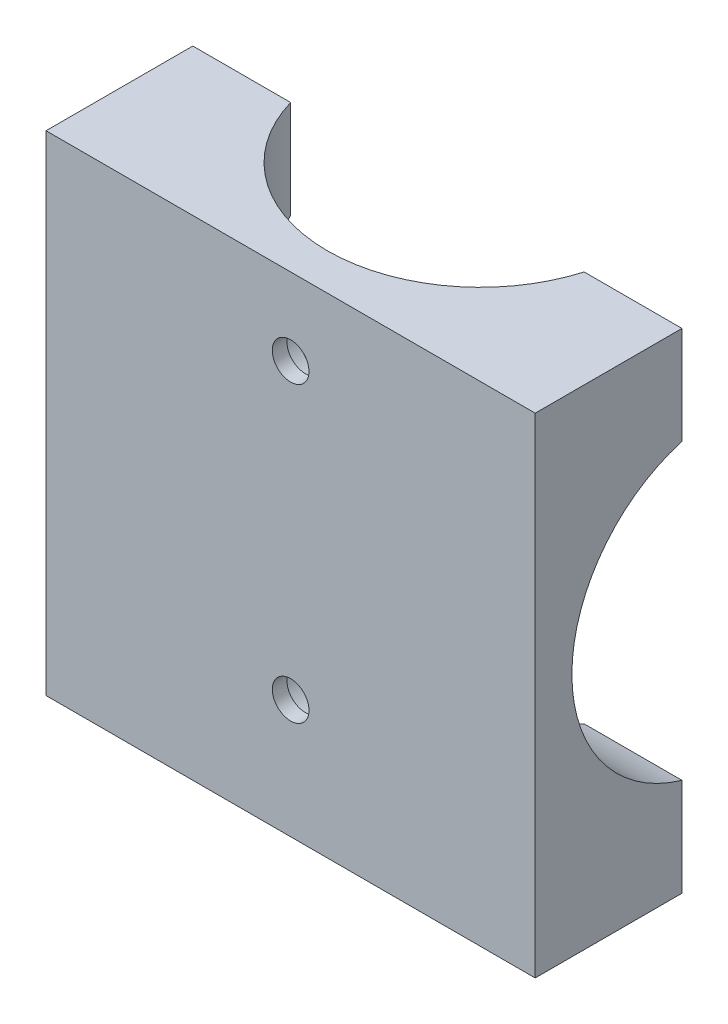
ISO-10303-21;
HEADER;
FILE_DESCRIPTION(('STEP AP214'),'2;1');
FILE_NAME('part.step','',(''),(''),'','','');
FILE_SCHEMA(('AUTOMOTIVE_DESIGN { 1 0 10303 214 1 1 1 1 }'));
ENDSEC;
DATA;
#1=APPLICATION_CONTEXT('core data for automotive mechanical design processes');
#2=APPLICATION_PROTOCOL_DEFINITION('international standard','automotive_design',2000,#1);
#3=PRODUCT_CONTEXT('',#1,'mechanical');
#4=PRODUCT('Part','Part','',(#3));
#5=PRODUCT_RELATED_PRODUCT_CATEGORY('part','',(#4));
#6=PRODUCT_DEFINITION_FORMATION('','',#4);
#7=PRODUCT_DEFINITION_CONTEXT('part definition',#1,'design');
#8=PRODUCT_DEFINITION('design','',#6,#7);
#9=PRODUCT_DEFINITION_SHAPE('','',#8);
#10=(LENGTH_UNIT() NAMED_UNIT(*) SI_UNIT(.MILLI.,.METRE.));
#11=(NAMED_UNIT(*) PLANE_ANGLE_UNIT() SI_UNIT($,.RADIAN.));
#12=(NAMED_UNIT(*) SI_UNIT($,.STERADIAN.) SOLID_ANGLE_UNIT());
#13=UNCERTAINTY_MEASURE_WITH_UNIT(LENGTH_MEASURE(1.E-05),#10,'distance_accuracy_value','');
#14=(GEOMETRIC_REPRESENTATION_CONTEXT(3) GLOBAL_UNCERTAINTY_ASSIGNED_CONTEXT((#13)) GLOBAL_UNIT_ASSIGNED_CONTEXT((#10,
#11,#12)) REPRESENTATION_CONTEXT('',''));
#15=CARTESIAN_POINT('',(0.,0.,0.));
#16=DIRECTION('',(0.,0.,1.));
#17=DIRECTION('',(1.,0.,0.));
#18=AXIS2_PLACEMENT_3D('',#15,#16,#17);
#19=CARTESIAN_POINT('',(-10.0552486187845,8.56187845303868,-18.));
#20=DIRECTION('',(0.,0.,1.));
#21=DIRECTION('',(1.,0.,0.));
#22=AXIS2_PLACEMENT_3D('',#19,#20,#21);
#23=CYLINDRICAL_SURFACE('',#22,3.);
#24=CARTESIAN_POINT('',(-10.0552486187845,5.56187845303867,9.));
#25=CARTESIAN_POINT('',(-9.88928468975582,5.56188347711594,8.99999707149678));
#26=CARTESIAN_POINT('',(-9.72326319785647,5.57569686327475,8.99666156348589));
#27=CARTESIAN_POINT('',(-9.39596432781316,5.63051119263405,8.98367839469325));
#28=CARTESIAN_POINT('',(-9.23468993557027,5.67152888103335,8.97402684621657));
#29=CARTESIAN_POINT('',(-8.92166022407052,5.77937078754303,8.9494823208195));
#30=CARTESIAN_POINT('',(-8.76989419553632,5.84616534289626,8.93459537028412));
#31=CARTESIAN_POINT('',(-8.47972343998691,6.00356388948456,8.90117254425133));
#32=CARTESIAN_POINT('',(-8.34131890403288,6.09416822111594,8.88263661658729));
#33=CARTESIAN_POINT('',(-8.07915598484482,6.2984426314142,8.84353860147846));
#34=CARTESIAN_POINT('',(-7.95568909777974,6.41248123408793,8.82294724543105));
#35=CARTESIAN_POINT('',(-7.72943781066511,6.65959732210331,8.7822574370147));
#36=CARTESIAN_POINT('',(-7.62665557253965,6.79267679507962,8.76215903636119));
#37=CARTESIAN_POINT('',(-7.44334868323439,7.07632428605612,8.72443796906196));
#38=CARTESIAN_POINT('',(-7.36314484830889,7.22710503679751,8.70685258153123));
#39=CARTESIAN_POINT('',(-7.22933278931121,7.54049828816715,8.67657334124478));
#40=CARTESIAN_POINT('',(-7.1757206770889,7.70310905506182,8.66387877343088));
#41=CARTESIAN_POINT('',(-7.0975980376979,8.03235502630757,8.64511846750074));
#42=CARTESIAN_POINT('',(-7.07256599477837,8.19885957456417,8.6389341034343));
#43=CARTESIAN_POINT('',(-7.05069052999367,8.53381083268142,8.63353896059455));
#44=CARTESIAN_POINT('',(-7.05384290196054,8.70225724899559,8.63432714125681));
#45=CARTESIAN_POINT('',(-7.08782949796511,9.03235441905155,8.64268113870075));
#46=CARTESIAN_POINT('',(-7.11804758477959,9.19407301822822,8.65009609212923));
#47=CARTESIAN_POINT('',(-7.20432720241265,9.5100757696865,8.67062837387853));
#48=CARTESIAN_POINT('',(-7.26039044506426,9.66435942877309,8.68374607991329));
#49=CARTESIAN_POINT('',(-7.39730740646671,9.96279143112302,8.71434767344448));
#50=CARTESIAN_POINT('',(-7.47838913631493,10.1068309059554,8.73187143257579));
#51=CARTESIAN_POINT('',(-7.6628817292207,10.3794829537612,8.76928750461965));
#52=CARTESIAN_POINT('',(-7.76629621535805,10.5080930183238,8.78918020161373));
#53=CARTESIAN_POINT('',(-7.99573367969606,10.7497720233574,8.82973202573901));
#54=CARTESIAN_POINT('',(-8.12227797488544,10.8623455521009,8.85039757880138));
#55=CARTESIAN_POINT('',(-8.39269269418761,11.064763172785,8.88969515949292));
#56=CARTESIAN_POINT('',(-8.53656356896312,11.1546066733313,8.90832713420486));
#57=CARTESIAN_POINT('',(-8.83822014159872,11.3091756736514,8.94153949569216));
#58=CARTESIAN_POINT('',(-8.99604583182398,11.3738259092765,8.95610770580191));
#59=CARTESIAN_POINT('',(-9.32075101270585,11.4755435320873,8.97946204741541));
#60=CARTESIAN_POINT('',(-9.48762890539686,11.5126157706655,8.98824919586507));
#61=CARTESIAN_POINT('',(-9.82146121913286,11.5573805176907,8.99890275427085));
#62=CARTESIAN_POINT('',(-9.98832013823952,11.5657483455002,9.00092821307533));
#63=CARTESIAN_POINT('',(-10.3210530003712,11.5547116861878,8.99828074194736));
#64=CARTESIAN_POINT('',(-10.4869270235495,11.5353094910514,8.99360836481759));
#65=CARTESIAN_POINT('',(-10.8106711988934,11.4698414745223,8.9781916395217));
#66=CARTESIAN_POINT('',(-10.9686191980958,11.4241393434649,8.96753015903628));
#67=CARTESIAN_POINT('',(-11.2746019189193,11.3077802613434,8.94133350156642));
#68=CARTESIAN_POINT('',(-11.422635685426,11.2371209100606,8.92579785583337));
#69=CARTESIAN_POINT('',(-11.7073101287402,11.0715118594408,8.89119101495817));
#70=CARTESIAN_POINT('',(-11.8437203861881,10.9761777361143,8.8720653178033));
#71=CARTESIAN_POINT('',(-12.0988476597508,10.7644215240253,8.83249364069873));
#72=CARTESIAN_POINT('',(-12.2175618695279,10.6479960969579,8.81204745207343));
#73=CARTESIAN_POINT('',(-12.4366731566839,10.3942376218301,8.77157421427706));
#74=CARTESIAN_POINT('',(-12.5365983592582,10.2564933309566,8.75156692626685));
#75=CARTESIAN_POINT('',(-12.7119088270253,9.96578802514195,8.71475387974524));
#76=CARTESIAN_POINT('',(-12.787295191018,9.81282769194521,8.69794797789618));
#77=CARTESIAN_POINT('',(-12.9108385539662,9.49686593949469,8.66961895193348));
#78=CARTESIAN_POINT('',(-12.9591561626436,9.33393024961745,8.65806474631072));
#79=CARTESIAN_POINT('',(-13.0276324216243,9.00193226801799,8.64150726636834));
#80=CARTESIAN_POINT('',(-13.0477966615344,8.83287119927691,8.6365026916888));
#81=CARTESIAN_POINT('',(-13.0591192832781,8.49820775275808,8.63370462206242));
#82=CARTESIAN_POINT('',(-13.0510296847072,8.33263195671199,8.6357241633848));
#83=CARTESIAN_POINT('',(-13.0077820750472,8.00527868881499,8.64631764604255));
#84=CARTESIAN_POINT('',(-12.9726245277855,7.84350115192733,8.6548914750658));
#85=CARTESIAN_POINT('',(-12.8766345318199,7.52908090049043,8.67752749767475));
#86=CARTESIAN_POINT('',(-12.8159326392407,7.37639618045493,8.69156175609398));
#87=CARTESIAN_POINT('',(-12.6706823545904,7.08327403915499,8.7235433612686));
#88=CARTESIAN_POINT('',(-12.5861309181331,6.94283818445233,8.74149120752573));
#89=CARTESIAN_POINT('',(-12.3931786958692,6.67454145291917,8.77981932552905));
#90=CARTESIAN_POINT('',(-12.2842512985747,6.54706612993995,8.80024786975326));
#91=CARTESIAN_POINT('',(-12.0466793665169,6.31195846498676,8.84093598311449));
#92=CARTESIAN_POINT('',(-11.9180302075269,6.20433078982844,8.86119551144403));
#93=CARTESIAN_POINT('',(-11.6421316175859,6.01026919348393,8.89965702995813));
#94=CARTESIAN_POINT('',(-11.4946127623786,5.92421004759667,8.91782002012192));
#95=CARTESIAN_POINT('',(-11.1867848470702,5.77824892029078,8.94963806105817));
#96=CARTESIAN_POINT('',(-11.0264855924758,5.71832710964706,8.96329652728546));
#97=CARTESIAN_POINT('',(-10.7311356444793,5.63583982790089,8.98240599014969));
#98=CARTESIAN_POINT('',(-10.597560685053,5.60816183725298,8.98895994495794));
#99=CARTESIAN_POINT('',(-10.3277528462628,5.5711796721868,8.99775801495248));
#100=CARTESIAN_POINT('',(-10.1915201367003,5.56187432781315,9.00000240456816));
#101=CARTESIAN_POINT('',(-10.0552486187845,5.56187845303867,9.));
#102=B_SPLINE_CURVE_WITH_KNOTS('',3,(#24,#25,#26,#27,#28,#29,#30,#31,#32,#33,#34,#35,#36,#37,
#38,#39,#40,#41,#42,#43,#44,#45,#46,#47,#48,#49,#50,#51,#52,#53,#54,#55,#56,#57,#58,#59,#60,#61,
#62,#63,#64,#65,#66,#67,#68,#69,#70,#71,#72,#73,#74,#75,#76,#77,#78,#79,#80,#81,#82,#83,#84,#85,
#86,#87,#88,#89,#90,#91,#92,#93,#94,#95,#96,#97,#98,#99,#100,#101),.UNSPECIFIED.,.T.,.F.,(4,2,2,
2,2,2,2,2,2,2,2,2,2,2,2,2,2,2,2,2,2,2,2,2,2,2,2,2,2,2,2,2,2,2,2,2,2,2,4),(0.,0.497392599366679,
0.995091645758824,1.49221966408501,1.98935478998519,2.49500570148357,3.00070943533306,
3.51327262050848,4.02576083835037,4.5287399535911,5.03164400680465,5.52338274964838,
6.01515406709138,6.51154667521171,7.00801987450002,7.51749958381934,8.0269925475217,
8.53799614678203,9.04890983140414,9.54771776810825,10.0464845383097,10.5385143736981,
11.0305915421211,11.5308523313794,12.031192370573,12.5427824523192,13.0543496229377,
13.5628484119093,14.0712462285018,14.5662165454702,15.0611783809799,15.5536406351284,
16.0461657803879,16.5505844610431,17.0551215958269,17.5678974206352,18.0802835459069,
18.4887142303991,18.897118905514),.UNSPECIFIED.);
#103=CARTESIAN_POINT('',(-10.0552486187845,5.56187845303867,9.));
#104=VERTEX_POINT('',#103);
#105=EDGE_CURVE('E194',#104,#104,#102,.T.);
#106=ORIENTED_EDGE('',*,*,#105,.F.);
#107=EDGE_LOOP('',(#106));
#108=FACE_BOUND('',#107,.T.);
#109=CARTESIAN_POINT('',(-10.0552486187845,8.56187845303868,10.8));
#110=DIRECTION('',(0.,0.,1.));
#111=DIRECTION('',(1.,0.,0.));
#112=AXIS2_PLACEMENT_3D('',#109,#110,#111);
#113=CIRCLE('',#112,3.);
#114=CARTESIAN_POINT('',(-7.05524861878453,8.56187845303868,10.8));
#115=VERTEX_POINT('',#114);
#116=EDGE_CURVE('E11',#115,#115,#113,.F.);
#117=ORIENTED_EDGE('',*,*,#116,.F.);
#118=EDGE_LOOP('',(#117));
#119=FACE_BOUND('',#118,.T.);
#120=ADVANCED_FACE('F38',(#108,#119),#23,.F.);
#121=CARTESIAN_POINT('',(-10.0552486187845,-15.4381215469613,-18.));
#122=DIRECTION('',(0.,0.,1.));
#123=DIRECTION('',(1.,0.,0.));
#124=AXIS2_PLACEMENT_3D('',#121,#122,#123);
#125=CYLINDRICAL_SURFACE('',#124,3.);
#126=CARTESIAN_POINT('',(-10.0552486187845,-18.4381215469613,9.));
#127=CARTESIAN_POINT('',(-9.88928468975582,-18.4381165228841,8.99999707149678));
#128=CARTESIAN_POINT('',(-9.72326319785647,-18.4243031367253,8.99666156348589));
#129=CARTESIAN_POINT('',(-9.39596432781316,-18.3694888073659,8.98367839469325));
#130=CARTESIAN_POINT('',(-9.23468993557027,-18.3284711189666,8.97402684621657));
#131=CARTESIAN_POINT('',(-8.92166022407052,-18.220629212457,8.9494823208195));
#132=CARTESIAN_POINT('',(-8.76989419553632,-18.1538346571037,8.93459537028412));
#133=CARTESIAN_POINT('',(-8.47972343998691,-17.9964361105154,8.90117254425133));
#134=CARTESIAN_POINT('',(-8.34131890403288,-17.9058317788841,8.88263661658729));
#135=CARTESIAN_POINT('',(-8.07915598484482,-17.7015573685858,8.84353860147846));
#136=CARTESIAN_POINT('',(-7.95568909777974,-17.5875187659121,8.82294724543105));
#137=CARTESIAN_POINT('',(-7.72943781066511,-17.3404026778967,8.7822574370147));
#138=CARTESIAN_POINT('',(-7.62665557253965,-17.2073232049204,8.7621590363612));
#139=CARTESIAN_POINT('',(-7.44334868323439,-16.9236757139439,8.72443796906196));
#140=CARTESIAN_POINT('',(-7.36314484830889,-16.7728949632025,8.70685258153123));
#141=CARTESIAN_POINT('',(-7.22933278931121,-16.4595017118328,8.67657334124478));
#142=CARTESIAN_POINT('',(-7.1757206770889,-16.2968909449382,8.66387877343088));
#143=CARTESIAN_POINT('',(-7.09759803769791,-15.9676449736924,8.64511846750074));
#144=CARTESIAN_POINT('',(-7.07256599477837,-15.8011404254358,8.6389341034343));
#145=CARTESIAN_POINT('',(-7.05069052999367,-15.4661891673186,8.63353896059455));
#146=CARTESIAN_POINT('',(-7.05384290196055,-15.2977427510044,8.63432714125681));
#147=CARTESIAN_POINT('',(-7.08782949796512,-14.9676455809484,8.64268113870075));
#148=CARTESIAN_POINT('',(-7.1180475847796,-14.8059269817718,8.65009609212923));
#149=CARTESIAN_POINT('',(-7.20432720241265,-14.4899242303135,8.67062837387853));
#150=CARTESIAN_POINT('',(-7.26039044506427,-14.3356405712269,8.68374607991329));
#151=CARTESIAN_POINT('',(-7.39730740646672,-14.037208568877,8.71434767344449));
#152=CARTESIAN_POINT('',(-7.47838913631493,-13.8931690940446,8.73187143257579));
#153=CARTESIAN_POINT('',(-7.66288172922071,-13.6205170462387,8.76928750461965));
#154=CARTESIAN_POINT('',(-7.76629621535806,-13.4919069816762,8.78918020161373));
#155=CARTESIAN_POINT('',(-7.99573367969607,-13.2502279766426,8.82973202573901));
#156=CARTESIAN_POINT('',(-8.12227797488545,-13.1376544478991,8.85039757880139));
#157=CARTESIAN_POINT('',(-8.39269269418762,-12.9352368272149,8.88969515949292));
#158=CARTESIAN_POINT('',(-8.53656356896313,-12.8453933266687,8.90832713420486));
#159=CARTESIAN_POINT('',(-8.83822014159873,-12.6908243263486,8.94153949569216));
#160=CARTESIAN_POINT('',(-8.99604583182399,-12.6261740907235,8.95610770580191));
#161=CARTESIAN_POINT('',(-9.32075101270586,-12.5244564679127,8.97946204741541));
#162=CARTESIAN_POINT('',(-9.48762890539687,-12.4873842293345,8.98824919586507));
#163=CARTESIAN_POINT('',(-9.82146121913287,-12.4426194823093,8.99890275427085));
#164=CARTESIAN_POINT('',(-9.98832013823952,-12.4342516544998,9.00092821307533));
#165=CARTESIAN_POINT('',(-10.3210530003712,-12.4452883138122,8.99828074194736));
#166=CARTESIAN_POINT('',(-10.4869270235495,-12.4646905089486,8.99360836481759));
#167=CARTESIAN_POINT('',(-10.8106711988934,-12.5301585254777,8.9781916395217));
#168=CARTESIAN_POINT('',(-10.9686191980958,-12.5758606565351,8.96753015903628));
#169=CARTESIAN_POINT('',(-11.2746019189193,-12.6922197386566,8.94133350156642));
#170=CARTESIAN_POINT('',(-11.422635685426,-12.7628790899394,8.92579785583337));
#171=CARTESIAN_POINT('',(-11.7073101287402,-12.9284881405592,8.89119101495817));
#172=CARTESIAN_POINT('',(-11.8437203861881,-13.0238222638857,8.8720653178033));
#173=CARTESIAN_POINT('',(-12.0988476597509,-13.2355784759747,8.83249364069872));
#174=CARTESIAN_POINT('',(-12.2175618695279,-13.3520039030421,8.81204745207343));
#175=CARTESIAN_POINT('',(-12.4366731566839,-13.6057623781699,8.77157421427706));
#176=CARTESIAN_POINT('',(-12.5365983592582,-13.7435066690434,8.75156692626685));
#177=CARTESIAN_POINT('',(-12.7119088270253,-14.0342119748581,8.71475387974524));
#178=CARTESIAN_POINT('',(-12.787295191018,-14.1871723080548,8.69794797789618));
#179=CARTESIAN_POINT('',(-12.9108385539662,-14.5031340605053,8.66961895193348));
#180=CARTESIAN_POINT('',(-12.9591561626436,-14.6660697503825,8.65806474631071));
#181=CARTESIAN_POINT('',(-13.0276324216243,-14.998067731982,8.64150726636834));
#182=CARTESIAN_POINT('',(-13.0477966615344,-15.1671288007231,8.6365026916888));
#183=CARTESIAN_POINT('',(-13.0591192832781,-15.5017922472419,8.63370462206242));
#184=CARTESIAN_POINT('',(-13.0510296847072,-15.667368043288,8.6357241633848));
#185=CARTESIAN_POINT('',(-13.0077820750472,-15.994721311185,8.64631764604255));
#186=CARTESIAN_POINT('',(-12.9726245277855,-16.1564988480727,8.6548914750658));
#187=CARTESIAN_POINT('',(-12.8766345318199,-16.4709190995096,8.67752749767475));
#188=CARTESIAN_POINT('',(-12.8159326392407,-16.6236038195451,8.69156175609398));
#189=CARTESIAN_POINT('',(-12.6706823545904,-16.916725960845,8.7235433612686));
#190=CARTESIAN_POINT('',(-12.5861309181331,-17.0571618155477,8.74149120752574));
#191=CARTESIAN_POINT('',(-12.3931786958692,-17.3254585470808,8.77981932552905));
#192=CARTESIAN_POINT('',(-12.2842512985747,-17.4529338700601,8.80024786975326));
#193=CARTESIAN_POINT('',(-12.0466793665169,-17.6880415350132,8.84093598311449));
#194=CARTESIAN_POINT('',(-11.9180302075269,-17.7956692101716,8.86119551144403));
#195=CARTESIAN_POINT('',(-11.6421316175859,-17.9897308065161,8.89965702995813));
#196=CARTESIAN_POINT('',(-11.4946127623786,-18.0757899524033,8.91782002012192));
#197=CARTESIAN_POINT('',(-11.1867848470702,-18.2217510797092,8.94963806105817));
#198=CARTESIAN_POINT('',(-11.0264855924758,-18.2816728903529,8.96329652728546));
#199=CARTESIAN_POINT('',(-10.7311356444793,-18.3641601720991,8.98240599014969));
#200=CARTESIAN_POINT('',(-10.597560685053,-18.391838162747,8.98895994495794));
#201=CARTESIAN_POINT('',(-10.3277528462628,-18.4288203278132,8.99775801495248));
#202=CARTESIAN_POINT('',(-10.1915201367003,-18.4381256721868,9.00000240456816));
#203=CARTESIAN_POINT('',(-10.0552486187845,-18.4381215469613,9.));
#204=B_SPLINE_CURVE_WITH_KNOTS('',3,(#126,#127,#128,#129,#130,#131,#132,#133,#134,#135,#136,
#137,#138,#139,#140,#141,#142,#143,#144,#145,#146,#147,#148,#149,#150,#151,#152,#153,#154,#155,
#156,#157,#158,#159,#160,#161,#162,#163,#164,#165,#166,#167,#168,#169,#170,#171,#172,#173,#174,
#175,#176,#177,#178,#179,#180,#181,#182,#183,#184,#185,#186,#187,#188,#189,#190,#191,#192,#193,
#194,#195,#196,#197,#198,#199,#200,#201,#202,#203),.UNSPECIFIED.,.T.,.F.,(4,2,2,2,2,2,2,2,2,2,2,
2,2,2,2,2,2,2,2,2,2,2,2,2,2,2,2,2,2,2,2,2,2,2,2,2,2,2,4),(0.,0.497392599366678,
0.995091645758824,1.49221966408501,1.98935478998519,2.49500570148357,3.00070943533306,
3.51327262050848,4.02576083835037,4.52873995359111,5.03164400680465,5.52338274964838,
6.01515406709138,6.51154667521171,7.00801987450003,7.51749958381934,8.0269925475217,
8.53799614678203,9.04890983140414,9.54771776810825,10.0464845383097,10.5385143736981,
11.0305915421211,11.5308523313794,12.031192370573,12.5427824523192,13.0543496229377,
13.5628484119093,14.0712462285018,14.5662165454702,15.0611783809799,15.5536406351284,
16.0461657803879,16.5505844610431,17.0551215958269,17.5678974206352,18.0802835459069,
18.4887142303991,18.897118905514),.UNSPECIFIED.);
#205=CARTESIAN_POINT('',(-10.0552486187845,-18.4381215469613,9.));
#206=VERTEX_POINT('',#205);
#207=EDGE_CURVE('E187',#206,#206,#204,.T.);
#208=ORIENTED_EDGE('',*,*,#207,.F.);
#209=EDGE_LOOP('',(#208));
#210=FACE_BOUND('',#209,.T.);
#211=CARTESIAN_POINT('',(-10.0552486187845,-15.4381215469613,10.8));
#212=DIRECTION('',(0.,0.,1.));
#213=DIRECTION('',(1.,0.,0.));
#214=AXIS2_PLACEMENT_3D('',#211,#212,#213);
#215=CIRCLE('',#214,3.);
#216=CARTESIAN_POINT('',(-7.05524861878454,-15.4381215469613,10.8));
#217=VERTEX_POINT('',#216);
#218=EDGE_CURVE('E46',#217,#217,#215,.F.);
#219=ORIENTED_EDGE('',*,*,#218,.F.);
#220=EDGE_LOOP('',(#219));
#221=FACE_BOUND('',#220,.T.);
#222=ADVANCED_FACE('F200',(#210,#221),#125,.F.);
#223=CARTESIAN_POINT('',(0.,0.,0.));
#224=DIRECTION('',(0.,0.,1.));
#225=DIRECTION('',(1.,0.,0.));
#226=AXIS2_PLACEMENT_3D('',#223,#224,#225);
#227=PLANE('',#226);
#228=DIRECTION('',(0.,1.,0.));
#229=VECTOR('',#228,1.);
#230=CARTESIAN_POINT('',(1.94475138121546,-25.1381215469613,0.));
#231=LINE('',#230,#229);
#232=CARTESIAN_POINT('',(1.94475138121546,-25.1381215469613,0.));
#233=VERTEX_POINT('',#232);
#234=CARTESIAN_POINT('',(1.94475138121546,-17.1381215469613,0.));
#235=VERTEX_POINT('',#234);
#236=EDGE_CURVE('E174',#233,#235,#231,.T.);
#237=ORIENTED_EDGE('',*,*,#236,.T.);
#238=DIRECTION('',(1.,0.,0.));
#239=VECTOR('',#238,1.);
#240=CARTESIAN_POINT('',(-30.0552486187845,-17.1381215469613,0.));
#241=LINE('',#240,#239);
#242=CARTESIAN_POINT('',(9.94475138121547,-17.1381215469613,0.));
#243=VERTEX_POINT('',#242);
#244=EDGE_CURVE('E135',#235,#243,#241,.T.);
#245=ORIENTED_EDGE('',*,*,#244,.T.);
#246=DIRECTION('',(0.,1.,0.));
#247=VECTOR('',#246,1.);
#248=CARTESIAN_POINT('',(9.94475138121546,14.8618784530387,0.));
#249=LINE('',#248,#247);
#250=CARTESIAN_POINT('',(9.94475138121547,-25.1381215469613,0.));
#251=VERTEX_POINT('',#250);
#252=EDGE_CURVE('E154',#251,#243,#249,.T.);
#253=ORIENTED_EDGE('',*,*,#252,.F.);
#254=DIRECTION('',(1.,0.,0.));
#255=VECTOR('',#254,1.);
#256=CARTESIAN_POINT('',(-30.0552486187845,-25.1381215469613,0.));
#257=LINE('',#256,#255);
#258=EDGE_CURVE('E142',#233,#251,#257,.T.);
#259=ORIENTED_EDGE('',*,*,#258,.F.);
#260=EDGE_LOOP('',(#237,#245,#253,#259));
#261=FACE_BOUND('',#260,.T.);
#262=ADVANCED_FACE('F205',(#261),#227,.F.);
#263=DIRECTION('',(0.,-1.,0.));
#264=VECTOR('',#263,1.);
#265=CARTESIAN_POINT('',(-30.0552486187845,14.8618784530387,0.));
#266=LINE('',#265,#264);
#267=CARTESIAN_POINT('',(-30.0552486187845,-17.1381215469613,0.));
#268=VERTEX_POINT('',#267);
#269=CARTESIAN_POINT('',(-30.0552486187845,-25.1381215469613,0.));
#270=VERTEX_POINT('',#269);
#271=EDGE_CURVE('E143',#268,#270,#266,.T.);
#272=ORIENTED_EDGE('',*,*,#271,.F.);
#273=DIRECTION('',(1.,0.,0.));
#274=VECTOR('',#273,1.);
#275=CARTESIAN_POINT('',(-30.0552486187845,-17.1381215469613,0.));
#276=LINE('',#275,#274);
#277=CARTESIAN_POINT('',(-22.0552486187845,-17.1381215469613,0.));
#278=VERTEX_POINT('',#277);
#279=EDGE_CURVE('E122',#268,#278,#276,.T.);
#280=ORIENTED_EDGE('',*,*,#279,.T.);
#281=DIRECTION('',(0.,1.,0.));
#282=VECTOR('',#281,1.);
#283=CARTESIAN_POINT('',(-22.0552486187845,-25.1381215469613,0.));
#284=LINE('',#283,#282);
#285=CARTESIAN_POINT('',(-22.0552486187845,-25.1381215469613,0.));
#286=VERTEX_POINT('',#285);
#287=EDGE_CURVE('E61',#278,#286,#284,.F.);
#288=ORIENTED_EDGE('',*,*,#287,.T.);
#289=EDGE_CURVE('E145',#270,#286,#257,.T.);
#290=ORIENTED_EDGE('',*,*,#289,.F.);
#291=EDGE_LOOP('',(#272,#280,#288,#290));
#292=FACE_BOUND('',#291,.T.);
#293=ADVANCED_FACE('F264',(#292),#227,.F.);
#294=CARTESIAN_POINT('',(-10.0552486187845,-25.1381215469613,-3.5));
#295=DIRECTION('',(0.,1.,0.));
#296=DIRECTION('',(0.,0.,1.));
#297=AXIS2_PLACEMENT_3D('',#294,#295,#296);
#298=CYLINDRICAL_SURFACE('',#297,12.5);
#299=ORIENTED_EDGE('',*,*,#105,.T.);
#300=EDGE_LOOP('',(#299));
#301=FACE_BOUND('',#300,.T.);
#302=CARTESIAN_POINT('',(-10.0552486187845,-5.13812154696133,-3.5));
#303=DIRECTION('',(-0.707106781186548,0.707106781186547,0.));
#304=DIRECTION('',(0.707106781186547,0.707106781186548,0.));
#305=AXIS2_PLACEMENT_3D('',#302,#303,#304);
#306=ELLIPSE('',#305,17.6776695296637,12.5);
#307=CARTESIAN_POINT('',(1.94475138121546,6.86187845303868,0.));
#308=VERTEX_POINT('',#307);
#309=CARTESIAN_POINT('',(-10.0552486187845,-5.13812154696133,9.));
#310=VERTEX_POINT('',#309);
#311=EDGE_CURVE('E177',#308,#310,#306,.F.);
#312=ORIENTED_EDGE('',*,*,#311,.T.);
#313=CARTESIAN_POINT('',(-10.0552486187845,-5.13812154696133,-3.5));
#314=DIRECTION('',(0.707106781186547,0.707106781186548,0.));
#315=DIRECTION('',(-0.707106781186548,0.707106781186547,0.));
#316=AXIS2_PLACEMENT_3D('',#313,#314,#315);
#317=ELLIPSE('',#316,17.6776695296637,12.5);
#318=CARTESIAN_POINT('',(-22.0552486187845,6.86187845303868,0.));
#319=VERTEX_POINT('',#318);
#320=EDGE_CURVE('E53',#310,#319,#317,.F.);
#321=ORIENTED_EDGE('',*,*,#320,.T.);
#322=CARTESIAN_POINT('',(-22.0552486187845,14.8618784530387,0.));
#323=VERTEX_POINT('',#322);
#324=EDGE_CURVE('E134',#323,#319,#284,.F.);
#325=ORIENTED_EDGE('',*,*,#324,.F.);
#326=CARTESIAN_POINT('',(-10.0552486187845,14.8618784530387,-3.5));
#327=DIRECTION('',(0.,1.,0.));
#328=DIRECTION('',(0.,0.,1.));
#329=AXIS2_PLACEMENT_3D('',#326,#327,#328);
#330=CIRCLE('',#329,12.5);
#331=CARTESIAN_POINT('',(1.94475138121546,14.8618784530387,0.));
#332=VERTEX_POINT('',#331);
#333=EDGE_CURVE('E228',#323,#332,#330,.T.);
#334=ORIENTED_EDGE('',*,*,#333,.T.);
#335=EDGE_CURVE('E173',#308,#332,#231,.T.);
#336=ORIENTED_EDGE('',*,*,#335,.F.);
#337=EDGE_LOOP('',(#312,#321,#325,#334,#336));
#338=FACE_BOUND('',#337,.T.);
#339=ADVANCED_FACE('F261',(#301,#338),#298,.F.);
#340=CARTESIAN_POINT('',(9.94475138121546,6.86187845303867,0.));
#341=VERTEX_POINT('',#340);
#342=CARTESIAN_POINT('',(9.94475138121546,14.8618784530387,0.));
#343=VERTEX_POINT('',#342);
#344=EDGE_CURVE('E153',#341,#343,#249,.T.);
#345=ORIENTED_EDGE('',*,*,#344,.F.);
#346=DIRECTION('',(1.,0.,0.));
#347=VECTOR('',#346,1.);
#348=CARTESIAN_POINT('',(-30.0552486187845,6.86187845303867,0.));
#349=LINE('',#348,#347);
#350=EDGE_CURVE('E136',#341,#308,#349,.F.);
#351=ORIENTED_EDGE('',*,*,#350,.T.);
#352=ORIENTED_EDGE('',*,*,#335,.T.);
#353=DIRECTION('',(-1.,0.,0.));
#354=VECTOR('',#353,1.);
#355=CARTESIAN_POINT('',(-30.0552486187845,14.8618784530387,0.));
#356=LINE('',#355,#354);
#357=EDGE_CURVE('E158',#343,#332,#356,.T.);
#358=ORIENTED_EDGE('',*,*,#357,.F.);
#359=EDGE_LOOP('',(#345,#351,#352,#358));
#360=FACE_BOUND('',#359,.T.);
#361=ADVANCED_FACE('F258',(#360),#227,.F.);
#362=CARTESIAN_POINT('',(-30.0552486187845,14.8618784530387,12.));
#363=DIRECTION('',(1.,0.,0.));
#364=DIRECTION('',(0.,1.,0.));
#365=AXIS2_PLACEMENT_3D('',#362,#363,#364);
#366=PLANE('',#365);
#367=CARTESIAN_POINT('',(-30.0552486187845,14.8618784530387,0.));
#368=VERTEX_POINT('',#367);
#369=CARTESIAN_POINT('',(-30.0552486187845,6.86187845303867,0.));
#370=VERTEX_POINT('',#369);
#371=EDGE_CURVE('E133',#368,#370,#266,.T.);
#372=ORIENTED_EDGE('',*,*,#371,.T.);
#373=CARTESIAN_POINT('',(-30.0552486187845,-5.13812154696133,-3.5));
#374=DIRECTION('',(1.,0.,0.));
#375=DIRECTION('',(0.,1.,0.));
#376=AXIS2_PLACEMENT_3D('',#373,#374,#375);
#377=CIRCLE('',#376,12.5);
#378=EDGE_CURVE('E118',#370,#268,#377,.T.);
#379=ORIENTED_EDGE('',*,*,#378,.T.);
#380=ORIENTED_EDGE('',*,*,#271,.T.);
#381=DIRECTION('',(0.,0.,-1.));
#382=VECTOR('',#381,1.);
#383=CARTESIAN_POINT('',(-30.0552486187845,-25.1381215469613,12.));
#384=LINE('',#383,#382);
#385=CARTESIAN_POINT('',(-30.0552486187845,-25.1381215469613,12.));
#386=VERTEX_POINT('',#385);
#387=EDGE_CURVE('E169',#386,#270,#384,.T.);
#388=ORIENTED_EDGE('',*,*,#387,.F.);
#389=DIRECTION('',(0.,-1.,0.));
#390=VECTOR('',#389,1.);
#391=CARTESIAN_POINT('',(-30.0552486187845,14.8618784530387,12.));
#392=LINE('',#391,#390);
#393=CARTESIAN_POINT('',(-30.0552486187845,14.8618784530387,12.));
#394=VERTEX_POINT('',#393);
#395=EDGE_CURVE('E161',#394,#386,#392,.T.);
#396=ORIENTED_EDGE('',*,*,#395,.F.);
#397=DIRECTION('',(0.,0.,-1.));
#398=VECTOR('',#397,1.);
#399=CARTESIAN_POINT('',(-30.0552486187845,14.8618784530387,12.));
#400=LINE('',#399,#398);
#401=EDGE_CURVE('E141',#394,#368,#400,.T.);
#402=ORIENTED_EDGE('',*,*,#401,.T.);
#403=EDGE_LOOP('',(#372,#379,#380,#388,#396,#402));
#404=FACE_BOUND('',#403,.T.);
#405=ADVANCED_FACE('F40',(#404),#366,.F.);
#406=CARTESIAN_POINT('',(-30.0552486187845,-25.1381215469613,12.));
#407=DIRECTION('',(0.,1.,0.));
#408=DIRECTION('',(0.,0.,1.));
#409=AXIS2_PLACEMENT_3D('',#406,#407,#408);
#410=PLANE('',#409);
#411=ORIENTED_EDGE('',*,*,#289,.T.);
#412=CARTESIAN_POINT('',(-10.0552486187845,-25.1381215469613,-3.5));
#413=DIRECTION('',(0.,1.,0.));
#414=DIRECTION('',(0.,0.,1.));
#415=AXIS2_PLACEMENT_3D('',#412,#413,#414);
#416=CIRCLE('',#415,12.5);
#417=EDGE_CURVE('E147',#286,#233,#416,.T.);
#418=ORIENTED_EDGE('',*,*,#417,.T.);
#419=ORIENTED_EDGE('',*,*,#258,.T.);
#420=DIRECTION('',(0.,0.,-1.));
#421=VECTOR('',#420,1.);
#422=CARTESIAN_POINT('',(9.94475138121547,-25.1381215469613,12.));
#423=LINE('',#422,#421);
#424=CARTESIAN_POINT('',(9.94475138121547,-25.1381215469613,12.));
#425=VERTEX_POINT('',#424);
#426=EDGE_CURVE('E166',#425,#251,#423,.T.);
#427=ORIENTED_EDGE('',*,*,#426,.F.);
#428=DIRECTION('',(1.,0.,0.));
#429=VECTOR('',#428,1.);
#430=CARTESIAN_POINT('',(-30.0552486187845,-25.1381215469613,12.));
#431=LINE('',#430,#429);
#432=EDGE_CURVE('E235',#386,#425,#431,.T.);
#433=ORIENTED_EDGE('',*,*,#432,.F.);
#434=ORIENTED_EDGE('',*,*,#387,.T.);
#435=EDGE_LOOP('',(#411,#418,#419,#427,#433,#434));
#436=FACE_BOUND('',#435,.T.);
#437=ADVANCED_FACE('F248',(#436),#410,.F.);
#438=CARTESIAN_POINT('',(9.94475138121546,14.8618784530387,12.));
#439=DIRECTION('',(-1.,0.,0.));
#440=DIRECTION('',(0.,-1.,0.));
#441=AXIS2_PLACEMENT_3D('',#438,#439,#440);
#442=PLANE('',#441);
#443=ORIENTED_EDGE('',*,*,#252,.T.);
#444=CARTESIAN_POINT('',(9.94475138121546,-5.13812154696133,-3.5));
#445=DIRECTION('',(1.,0.,0.));
#446=DIRECTION('',(0.,1.,0.));
#447=AXIS2_PLACEMENT_3D('',#444,#445,#446);
#448=CIRCLE('',#447,12.5);
#449=EDGE_CURVE('E126',#341,#243,#448,.T.);
#450=ORIENTED_EDGE('',*,*,#449,.F.);
#451=ORIENTED_EDGE('',*,*,#344,.T.);
#452=DIRECTION('',(0.,0.,-1.));
#453=VECTOR('',#452,1.);
#454=CARTESIAN_POINT('',(9.94475138121546,14.8618784530387,12.));
#455=LINE('',#454,#453);
#456=CARTESIAN_POINT('',(9.94475138121546,14.8618784530387,12.));
#457=VERTEX_POINT('',#456);
#458=EDGE_CURVE('E163',#457,#343,#455,.T.);
#459=ORIENTED_EDGE('',*,*,#458,.F.);
#460=DIRECTION('',(0.,1.,0.));
#461=VECTOR('',#460,1.);
#462=CARTESIAN_POINT('',(9.94475138121546,14.8618784530387,12.));
#463=LINE('',#462,#461);
#464=EDGE_CURVE('E236',#425,#457,#463,.T.);
#465=ORIENTED_EDGE('',*,*,#464,.F.);
#466=ORIENTED_EDGE('',*,*,#426,.T.);
#467=EDGE_LOOP('',(#443,#450,#451,#459,#465,#466));
#468=FACE_BOUND('',#467,.T.);
#469=ADVANCED_FACE('F253',(#468),#442,.F.);
#470=CARTESIAN_POINT('',(-30.0552486187845,14.8618784530387,12.));
#471=DIRECTION('',(0.,-1.,0.));
#472=DIRECTION('',(0.,0.,-1.));
#473=AXIS2_PLACEMENT_3D('',#470,#471,#472);
#474=PLANE('',#473);
#475=ORIENTED_EDGE('',*,*,#357,.T.);
#476=ORIENTED_EDGE('',*,*,#333,.F.);
#477=EDGE_CURVE('E157',#323,#368,#356,.T.);
#478=ORIENTED_EDGE('',*,*,#477,.T.);
#479=ORIENTED_EDGE('',*,*,#401,.F.);
#480=DIRECTION('',(-1.,0.,0.));
#481=VECTOR('',#480,1.);
#482=CARTESIAN_POINT('',(-30.0552486187845,14.8618784530387,12.));
#483=LINE('',#482,#481);
#484=EDGE_CURVE('E149',#457,#394,#483,.T.);
#485=ORIENTED_EDGE('',*,*,#484,.F.);
#486=ORIENTED_EDGE('',*,*,#458,.T.);
#487=EDGE_LOOP('',(#475,#476,#478,#479,#485,#486));
#488=FACE_BOUND('',#487,.T.);
#489=ADVANCED_FACE('F245',(#488),#474,.F.);
#490=CARTESIAN_POINT('',(0.,0.,12.));
#491=DIRECTION('',(0.,0.,1.));
#492=DIRECTION('',(1.,0.,0.));
#493=AXIS2_PLACEMENT_3D('',#490,#491,#492);
#494=PLANE('',#493);
#495=ORIENTED_EDGE('',*,*,#395,.T.);
#496=ORIENTED_EDGE('',*,*,#432,.T.);
#497=ORIENTED_EDGE('',*,*,#464,.T.);
#498=ORIENTED_EDGE('',*,*,#484,.T.);
#499=EDGE_LOOP('',(#495,#496,#497,#498));
#500=FACE_BOUND('',#499,.T.);
#501=CARTESIAN_POINT('',(-10.0552486187845,-15.4381215469613,12.));
#502=DIRECTION('',(0.,0.,1.));
#503=DIRECTION('',(1.,0.,0.));
#504=AXIS2_PLACEMENT_3D('',#501,#502,#503);
#505=CIRCLE('',#504,1.5);
#506=CARTESIAN_POINT('',(-8.55524861878454,-15.4381215469613,12.));
#507=VERTEX_POINT('',#506);
#508=EDGE_CURVE('E219',#507,#507,#505,.T.);
#509=ORIENTED_EDGE('',*,*,#508,.F.);
#510=EDGE_LOOP('',(#509));
#511=FACE_BOUND('',#510,.T.);
#512=CARTESIAN_POINT('',(-10.0552486187845,8.56187845303868,12.));
#513=DIRECTION('',(0.,0.,1.));
#514=DIRECTION('',(1.,0.,0.));
#515=AXIS2_PLACEMENT_3D('',#512,#513,#514);
#516=CIRCLE('',#515,1.5);
#517=CARTESIAN_POINT('',(-8.55524861878453,8.56187845303868,12.));
#518=VERTEX_POINT('',#517);
#519=EDGE_CURVE('E414',#518,#518,#516,.T.);
#520=ORIENTED_EDGE('',*,*,#519,.F.);
#521=EDGE_LOOP('',(#520));
#522=FACE_BOUND('',#521,.T.);
#523=ADVANCED_FACE('F241',(#500,#511,#522),#494,.T.);
#524=ORIENTED_EDGE('',*,*,#324,.T.);
#525=DIRECTION('',(1.,0.,0.));
#526=VECTOR('',#525,1.);
#527=CARTESIAN_POINT('',(-30.0552486187845,6.86187845303867,0.));
#528=LINE('',#527,#526);
#529=EDGE_CURVE('E121',#319,#370,#528,.F.);
#530=ORIENTED_EDGE('',*,*,#529,.T.);
#531=ORIENTED_EDGE('',*,*,#371,.F.);
#532=ORIENTED_EDGE('',*,*,#477,.F.);
#533=EDGE_LOOP('',(#524,#530,#531,#532));
#534=FACE_BOUND('',#533,.T.);
#535=ADVANCED_FACE('F131',(#534),#227,.F.);
#536=ORIENTED_EDGE('',*,*,#207,.T.);
#537=EDGE_LOOP('',(#536));
#538=FACE_BOUND('',#537,.T.);
#539=CARTESIAN_POINT('',(-10.0552486187845,-5.13812154696133,-3.5));
#540=DIRECTION('',(-0.707106781186548,0.707106781186547,0.));
#541=DIRECTION('',(0.707106781186547,0.707106781186548,0.));
#542=AXIS2_PLACEMENT_3D('',#539,#540,#541);
#543=ELLIPSE('',#542,17.6776695296637,12.5);
#544=EDGE_CURVE('E180',#278,#310,#543,.T.);
#545=ORIENTED_EDGE('',*,*,#544,.T.);
#546=CARTESIAN_POINT('',(-10.0552486187845,-5.13812154696133,-3.5));
#547=DIRECTION('',(0.707106781186547,0.707106781186548,0.));
#548=DIRECTION('',(-0.707106781186548,0.707106781186547,0.));
#549=AXIS2_PLACEMENT_3D('',#546,#547,#548);
#550=ELLIPSE('',#549,17.6776695296637,12.5);
#551=EDGE_CURVE('E183',#310,#235,#550,.T.);
#552=ORIENTED_EDGE('',*,*,#551,.T.);
#553=ORIENTED_EDGE('',*,*,#236,.F.);
#554=ORIENTED_EDGE('',*,*,#417,.F.);
#555=ORIENTED_EDGE('',*,*,#287,.F.);
#556=EDGE_LOOP('',(#545,#552,#553,#554,#555));
#557=FACE_BOUND('',#556,.T.);
#558=ADVANCED_FACE('F196',(#538,#557),#298,.F.);
#559=CARTESIAN_POINT('',(-30.0552486187845,-5.13812154696133,-3.5));
#560=DIRECTION('',(1.,0.,0.));
#561=DIRECTION('',(0.,1.,0.));
#562=AXIS2_PLACEMENT_3D('',#559,#560,#561);
#563=CYLINDRICAL_SURFACE('',#562,12.5);
#564=ORIENTED_EDGE('',*,*,#551,.F.);
#565=ORIENTED_EDGE('',*,*,#311,.F.);
#566=ORIENTED_EDGE('',*,*,#350,.F.);
#567=ORIENTED_EDGE('',*,*,#449,.T.);
#568=ORIENTED_EDGE('',*,*,#244,.F.);
#569=EDGE_LOOP('',(#564,#565,#566,#567,#568));
#570=FACE_BOUND('',#569,.T.);
#571=ADVANCED_FACE('F212',(#570),#563,.F.);
#572=ORIENTED_EDGE('',*,*,#320,.F.);
#573=ORIENTED_EDGE('',*,*,#544,.F.);
#574=ORIENTED_EDGE('',*,*,#279,.F.);
#575=ORIENTED_EDGE('',*,*,#378,.F.);
#576=ORIENTED_EDGE('',*,*,#529,.F.);
#577=EDGE_LOOP('',(#572,#573,#574,#575,#576));
#578=FACE_BOUND('',#577,.T.);
#579=ADVANCED_FACE('F120',(#578),#563,.F.);
#580=CARTESIAN_POINT('',(-10.0552486187845,-15.4381215469613,10.8));
#581=DIRECTION('',(0.,0.,1.));
#582=DIRECTION('',(1.,0.,0.));
#583=AXIS2_PLACEMENT_3D('',#580,#581,#582);
#584=PLANE('',#583);
#585=CARTESIAN_POINT('',(-10.0552486187845,-15.4381215469613,10.8));
#586=DIRECTION('',(0.,0.,1.));
#587=DIRECTION('',(1.,0.,0.));
#588=AXIS2_PLACEMENT_3D('',#585,#586,#587);
#589=CIRCLE('',#588,1.5);
#590=CARTESIAN_POINT('',(-8.55524861878454,-15.4381215469613,10.8));
#591=VERTEX_POINT('',#590);
#592=EDGE_CURVE('E195',#591,#591,#589,.T.);
#593=ORIENTED_EDGE('',*,*,#592,.T.);
#594=EDGE_LOOP('',(#593));
#595=FACE_BOUND('',#594,.T.);
#596=ORIENTED_EDGE('',*,*,#218,.T.);
#597=EDGE_LOOP('',(#596));
#598=FACE_BOUND('',#597,.T.);
#599=ADVANCED_FACE('F207',(#595,#598),#584,.F.);
#600=CARTESIAN_POINT('',(-10.0552486187845,-15.4381215469613,10.8));
#601=DIRECTION('',(0.,0.,1.));
#602=DIRECTION('',(1.,0.,0.));
#603=AXIS2_PLACEMENT_3D('',#600,#601,#602);
#604=CYLINDRICAL_SURFACE('',#603,1.5);
#605=ORIENTED_EDGE('',*,*,#592,.F.);
#606=EDGE_LOOP('',(#605));
#607=FACE_BOUND('',#606,.T.);
#608=ORIENTED_EDGE('',*,*,#508,.T.);
#609=EDGE_LOOP('',(#608));
#610=FACE_BOUND('',#609,.T.);
#611=ADVANCED_FACE('F369',(#607,#610),#604,.F.);
#612=CARTESIAN_POINT('',(-10.0552486187845,8.56187845303868,10.8));
#613=DIRECTION('',(0.,0.,1.));
#614=DIRECTION('',(1.,0.,0.));
#615=AXIS2_PLACEMENT_3D('',#612,#613,#614);
#616=PLANE('',#615);
#617=CARTESIAN_POINT('',(-10.0552486187845,8.56187845303868,10.8));
#618=DIRECTION('',(0.,0.,1.));
#619=DIRECTION('',(1.,0.,0.));
#620=AXIS2_PLACEMENT_3D('',#617,#618,#619);
#621=CIRCLE('',#620,1.5);
#622=CARTESIAN_POINT('',(-8.55524861878453,8.56187845303868,10.8));
#623=VERTEX_POINT('',#622);
#624=EDGE_CURVE('E411',#623,#623,#621,.T.);
#625=ORIENTED_EDGE('',*,*,#624,.T.);
#626=EDGE_LOOP('',(#625));
#627=FACE_BOUND('',#626,.T.);
#628=ORIENTED_EDGE('',*,*,#116,.T.);
#629=EDGE_LOOP('',(#628));
#630=FACE_BOUND('',#629,.T.);
#631=ADVANCED_FACE('F378',(#627,#630),#616,.F.);
#632=CARTESIAN_POINT('',(-10.0552486187845,8.56187845303868,10.8));
#633=DIRECTION('',(0.,0.,1.));
#634=DIRECTION('',(1.,0.,0.));
#635=AXIS2_PLACEMENT_3D('',#632,#633,#634);
#636=CYLINDRICAL_SURFACE('',#635,1.5);
#637=ORIENTED_EDGE('',*,*,#624,.F.);
#638=EDGE_LOOP('',(#637));
#639=FACE_BOUND('',#638,.T.);
#640=ORIENTED_EDGE('',*,*,#519,.T.);
#641=EDGE_LOOP('',(#640));
#642=FACE_BOUND('',#641,.T.);
#643=ADVANCED_FACE('F388',(#639,#642),#636,.F.);
#644=CLOSED_SHELL('',(#120,#222,#262,#293,#339,#361,#405,#437,#469,#489,#523,#535,#558,#571,
#579,#599,#611,#631,#643));
#645=MANIFOLD_SOLID_BREP('B2',#644);
#646=ADVANCED_BREP_SHAPE_REPRESENTATION('',(#18,#645),#14);
#647=SHAPE_DEFINITION_REPRESENTATION(#9,#646);
ENDSEC;
END-ISO-10303-21;
